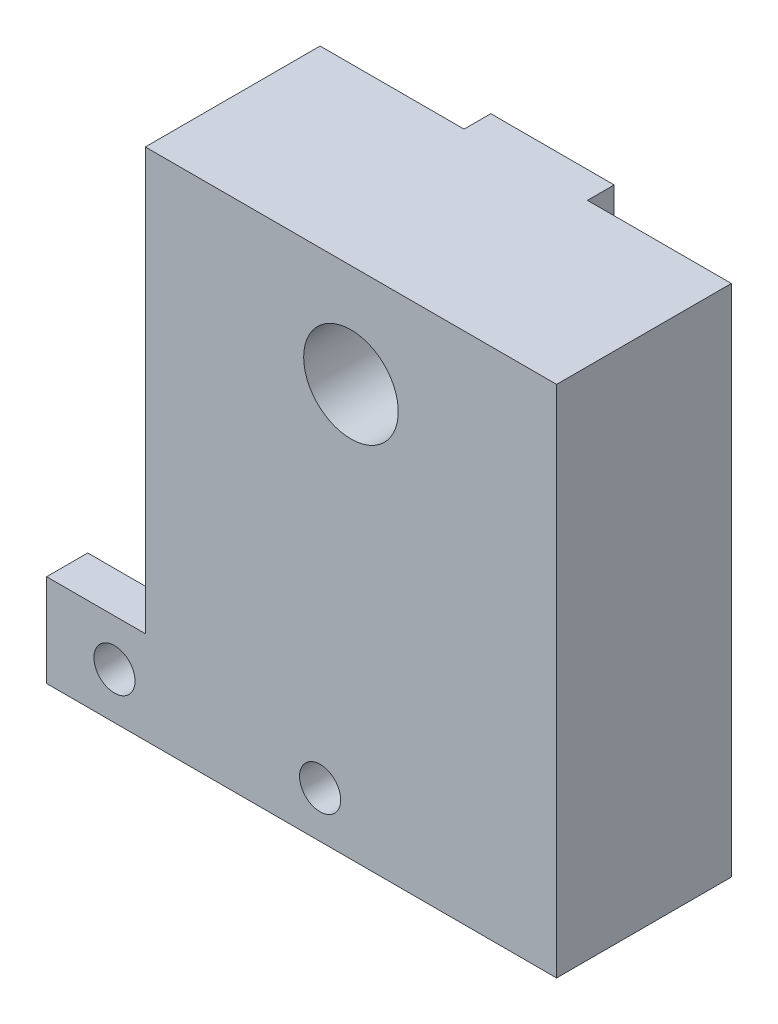
ISO-10303-21;
HEADER;
FILE_DESCRIPTION(('STEP AP214'),'2;1');
FILE_NAME('part.step','',(''),(''),'','','');
FILE_SCHEMA(('AUTOMOTIVE_DESIGN { 1 0 10303 214 1 1 1 1 }'));
ENDSEC;
DATA;
#1=APPLICATION_CONTEXT('core data for automotive mechanical design processes');
#2=APPLICATION_PROTOCOL_DEFINITION('international standard','automotive_design',2000,#1);
#3=PRODUCT_CONTEXT('',#1,'mechanical');
#4=PRODUCT('Part','Part','',(#3));
#5=PRODUCT_RELATED_PRODUCT_CATEGORY('part','',(#4));
#6=PRODUCT_DEFINITION_FORMATION('','',#4);
#7=PRODUCT_DEFINITION_CONTEXT('part definition',#1,'design');
#8=PRODUCT_DEFINITION('design','',#6,#7);
#9=PRODUCT_DEFINITION_SHAPE('','',#8);
#10=(LENGTH_UNIT() NAMED_UNIT(*) SI_UNIT(.MILLI.,.METRE.));
#11=(NAMED_UNIT(*) PLANE_ANGLE_UNIT() SI_UNIT($,.RADIAN.));
#12=(NAMED_UNIT(*) SI_UNIT($,.STERADIAN.) SOLID_ANGLE_UNIT());
#13=UNCERTAINTY_MEASURE_WITH_UNIT(LENGTH_MEASURE(1.E-05),#10,'distance_accuracy_value','');
#14=(GEOMETRIC_REPRESENTATION_CONTEXT(3) GLOBAL_UNCERTAINTY_ASSIGNED_CONTEXT((#13)) GLOBAL_UNIT_ASSIGNED_CONTEXT((#10,
#11,#12)) REPRESENTATION_CONTEXT('',''));
#15=CARTESIAN_POINT('',(0.,0.,0.));
#16=DIRECTION('',(0.,0.,1.));
#17=DIRECTION('',(1.,0.,0.));
#18=AXIS2_PLACEMENT_3D('',#15,#16,#17);
#19=CARTESIAN_POINT('',(0.,0.,0.));
#20=DIRECTION('',(0.,0.,-1.));
#21=DIRECTION('',(-1.,0.,0.));
#22=AXIS2_PLACEMENT_3D('',#19,#20,#21);
#23=PLANE('',#22);
#24=CARTESIAN_POINT('',(-1.5,2.25,0.));
#25=DIRECTION('',(0.,0.,-1.));
#26=DIRECTION('',(-1.,0.,0.));
#27=AXIS2_PLACEMENT_3D('',#24,#25,#26);
#28=CIRCLE('',#27,1.);
#29=CARTESIAN_POINT('',(-2.5,2.25,0.));
#30=VERTEX_POINT('',#29);
#31=EDGE_CURVE('E158',#30,#30,#28,.T.);
#32=ORIENTED_EDGE('',*,*,#31,.F.);
#33=EDGE_LOOP('',(#32));
#34=FACE_BOUND('',#33,.T.);
#35=CARTESIAN_POINT('',(8.5,2.25,0.));
#36=DIRECTION('',(0.,0.,-1.));
#37=DIRECTION('',(-1.,0.,0.));
#38=AXIS2_PLACEMENT_3D('',#35,#36,#37);
#39=CIRCLE('',#38,1.);
#40=CARTESIAN_POINT('',(7.5,2.25,0.));
#41=VERTEX_POINT('',#40);
#42=EDGE_CURVE('E150',#41,#41,#39,.T.);
#43=ORIENTED_EDGE('',*,*,#42,.F.);
#44=EDGE_LOOP('',(#43));
#45=FACE_BOUND('',#44,.T.);
#46=DIRECTION('',(-1.,0.,0.));
#47=VECTOR('',#46,1.);
#48=CARTESIAN_POINT('',(20.,15.,0.));
#49=LINE('',#48,#47);
#50=CARTESIAN_POINT('',(18.,15.,0.));
#51=VERTEX_POINT('',#50);
#52=CARTESIAN_POINT('',(0.,15.,0.));
#53=VERTEX_POINT('',#52);
#54=EDGE_CURVE('E142',#51,#53,#49,.T.);
#55=ORIENTED_EDGE('',*,*,#54,.F.);
#56=DIRECTION('',(0.,1.,0.));
#57=VECTOR('',#56,1.);
#58=CARTESIAN_POINT('',(18.,15.,0.));
#59=LINE('',#58,#57);
#60=CARTESIAN_POINT('',(18.,0.,0.));
#61=VERTEX_POINT('',#60);
#62=EDGE_CURVE('E153',#61,#51,#59,.T.);
#63=ORIENTED_EDGE('',*,*,#62,.F.);
#64=DIRECTION('',(1.,0.,0.));
#65=VECTOR('',#64,1.);
#66=CARTESIAN_POINT('',(0.,0.,0.));
#67=LINE('',#66,#65);
#68=CARTESIAN_POINT('',(-4.8,0.,0.));
#69=VERTEX_POINT('',#68);
#70=EDGE_CURVE('E235',#69,#61,#67,.T.);
#71=ORIENTED_EDGE('',*,*,#70,.F.);
#72=DIRECTION('',(0.,-1.,0.));
#73=VECTOR('',#72,1.);
#74=CARTESIAN_POINT('',(-4.8,0.,0.));
#75=LINE('',#74,#73);
#76=CARTESIAN_POINT('',(-4.8,4.5,0.));
#77=VERTEX_POINT('',#76);
#78=EDGE_CURVE('E177',#77,#69,#75,.T.);
#79=ORIENTED_EDGE('',*,*,#78,.F.);
#80=DIRECTION('',(-1.,0.,0.));
#81=VECTOR('',#80,1.);
#82=CARTESIAN_POINT('',(0.,4.5,0.));
#83=LINE('',#82,#81);
#84=CARTESIAN_POINT('',(0.,4.5,0.));
#85=VERTEX_POINT('',#84);
#86=EDGE_CURVE('E172',#85,#77,#83,.T.);
#87=ORIENTED_EDGE('',*,*,#86,.F.);
#88=DIRECTION('',(0.,-1.,0.));
#89=VECTOR('',#88,1.);
#90=CARTESIAN_POINT('',(0.,0.,0.));
#91=LINE('',#90,#89);
#92=EDGE_CURVE('E230',#53,#85,#91,.T.);
#93=ORIENTED_EDGE('',*,*,#92,.F.);
#94=EDGE_LOOP('',(#55,#63,#71,#79,#87,#93));
#95=FACE_BOUND('',#94,.T.);
#96=ADVANCED_FACE('F33',(#34,#45,#95),#23,.T.);
#97=CARTESIAN_POINT('',(20.,15.,-6.5));
#98=DIRECTION('',(0.,1.,0.));
#99=DIRECTION('',(0.,0.,1.));
#100=AXIS2_PLACEMENT_3D('',#97,#98,#99);
#101=PLANE('',#100);
#102=DIRECTION('',(0.,0.,1.));
#103=VECTOR('',#102,1.);
#104=CARTESIAN_POINT('',(18.,15.,-21.6327459504216));
#105=LINE('',#104,#103);
#106=CARTESIAN_POINT('',(18.,15.,-6.5));
#107=VERTEX_POINT('',#106);
#108=EDGE_CURVE('E148',#107,#51,#105,.T.);
#109=ORIENTED_EDGE('',*,*,#108,.T.);
#110=ORIENTED_EDGE('',*,*,#54,.T.);
#111=DIRECTION('',(0.,0.,1.));
#112=VECTOR('',#111,1.);
#113=CARTESIAN_POINT('',(0.,15.,-6.5));
#114=LINE('',#113,#112);
#115=CARTESIAN_POINT('',(0.,15.,-6.5));
#116=VERTEX_POINT('',#115);
#117=EDGE_CURVE('E226',#116,#53,#114,.T.);
#118=ORIENTED_EDGE('',*,*,#117,.F.);
#119=DIRECTION('',(-1.,0.,0.));
#120=VECTOR('',#119,1.);
#121=CARTESIAN_POINT('',(20.,15.,-6.5));
#122=LINE('',#121,#120);
#123=CARTESIAN_POINT('',(7.,15.,-6.5));
#124=VERTEX_POINT('',#123);
#125=EDGE_CURVE('E141',#124,#116,#122,.T.);
#126=ORIENTED_EDGE('',*,*,#125,.F.);
#127=DIRECTION('',(0.,0.,1.));
#128=VECTOR('',#127,1.);
#129=CARTESIAN_POINT('',(7.,15.,-7.8));
#130=LINE('',#129,#128);
#131=CARTESIAN_POINT('',(7.,15.,-7.8));
#132=VERTEX_POINT('',#131);
#133=EDGE_CURVE('E203',#132,#124,#130,.T.);
#134=ORIENTED_EDGE('',*,*,#133,.F.);
#135=DIRECTION('',(-1.,0.,0.));
#136=VECTOR('',#135,1.);
#137=CARTESIAN_POINT('',(13.,15.,-7.8));
#138=LINE('',#137,#136);
#139=CARTESIAN_POINT('',(13.,15.,-7.8));
#140=VERTEX_POINT('',#139);
#141=EDGE_CURVE('E201',#140,#132,#138,.T.);
#142=ORIENTED_EDGE('',*,*,#141,.F.);
#143=DIRECTION('',(0.,0.,1.));
#144=VECTOR('',#143,1.);
#145=CARTESIAN_POINT('',(13.,15.,-7.8));
#146=LINE('',#145,#144);
#147=CARTESIAN_POINT('',(13.,15.,-6.5));
#148=VERTEX_POINT('',#147);
#149=EDGE_CURVE('E210',#140,#148,#146,.T.);
#150=ORIENTED_EDGE('',*,*,#149,.T.);
#151=EDGE_CURVE('E219',#107,#148,#122,.T.);
#152=ORIENTED_EDGE('',*,*,#151,.F.);
#153=EDGE_LOOP('',(#109,#110,#118,#126,#134,#142,#150,#152));
#154=FACE_BOUND('',#153,.T.);
#155=ADVANCED_FACE('F266',(#154),#101,.F.);
#156=CARTESIAN_POINT('',(0.,0.,-6.5));
#157=DIRECTION('',(0.,0.,-1.));
#158=DIRECTION('',(-1.,0.,0.));
#159=AXIS2_PLACEMENT_3D('',#156,#157,#158);
#160=PLANE('',#159);
#161=DIRECTION('',(0.,1.,0.));
#162=VECTOR('',#161,1.);
#163=CARTESIAN_POINT('',(7.,15.,-6.5));
#164=LINE('',#163,#162);
#165=CARTESIAN_POINT('',(7.,25.,-6.5));
#166=VERTEX_POINT('',#165);
#167=EDGE_CURVE('E192',#124,#166,#164,.T.);
#168=ORIENTED_EDGE('',*,*,#167,.F.);
#169=ORIENTED_EDGE('',*,*,#125,.T.);
#170=DIRECTION('',(0.,1.,0.));
#171=VECTOR('',#170,1.);
#172=CARTESIAN_POINT('',(0.,25.,-6.5));
#173=LINE('',#172,#171);
#174=CARTESIAN_POINT('',(0.,25.,-6.5));
#175=VERTEX_POINT('',#174);
#176=EDGE_CURVE('E221',#116,#175,#173,.T.);
#177=ORIENTED_EDGE('',*,*,#176,.T.);
#178=DIRECTION('',(1.,0.,0.));
#179=VECTOR('',#178,1.);
#180=CARTESIAN_POINT('',(20.,25.,-6.5));
#181=LINE('',#180,#179);
#182=EDGE_CURVE('E224',#175,#166,#181,.T.);
#183=ORIENTED_EDGE('',*,*,#182,.T.);
#184=EDGE_LOOP('',(#168,#169,#177,#183));
#185=FACE_BOUND('',#184,.T.);
#186=ADVANCED_FACE('F282',(#185),#160,.T.);
#187=CARTESIAN_POINT('',(0.,0.,2.));
#188=DIRECTION('',(1.,0.,0.));
#189=DIRECTION('',(0.,0.,-1.));
#190=AXIS2_PLACEMENT_3D('',#187,#188,#189);
#191=PLANE('',#190);
#192=ORIENTED_EDGE('',*,*,#92,.T.);
#193=DIRECTION('',(0.,0.,1.));
#194=VECTOR('',#193,1.);
#195=CARTESIAN_POINT('',(0.,4.5,-6.57951365983839));
#196=LINE('',#195,#194);
#197=CARTESIAN_POINT('',(0.,4.5,2.));
#198=VERTEX_POINT('',#197);
#199=EDGE_CURVE('E183',#85,#198,#196,.T.);
#200=ORIENTED_EDGE('',*,*,#199,.T.);
#201=DIRECTION('',(0.,-1.,0.));
#202=VECTOR('',#201,1.);
#203=CARTESIAN_POINT('',(0.,0.,2.));
#204=LINE('',#203,#202);
#205=CARTESIAN_POINT('',(0.,25.,2.));
#206=VERTEX_POINT('',#205);
#207=EDGE_CURVE('E231',#206,#198,#204,.T.);
#208=ORIENTED_EDGE('',*,*,#207,.F.);
#209=DIRECTION('',(0.,0.,-1.));
#210=VECTOR('',#209,1.);
#211=CARTESIAN_POINT('',(0.,25.,2.));
#212=LINE('',#211,#210);
#213=EDGE_CURVE('E240',#206,#175,#212,.T.);
#214=ORIENTED_EDGE('',*,*,#213,.T.);
#215=ORIENTED_EDGE('',*,*,#176,.F.);
#216=ORIENTED_EDGE('',*,*,#117,.T.);
#217=EDGE_LOOP('',(#192,#200,#208,#214,#215,#216));
#218=FACE_BOUND('',#217,.T.);
#219=ADVANCED_FACE('F35',(#218),#191,.F.);
#220=CARTESIAN_POINT('',(0.,0.,2.));
#221=DIRECTION('',(0.,1.,0.));
#222=DIRECTION('',(0.,0.,1.));
#223=AXIS2_PLACEMENT_3D('',#220,#221,#222);
#224=PLANE('',#223);
#225=ORIENTED_EDGE('',*,*,#70,.T.);
#226=DIRECTION('',(0.,0.,1.));
#227=VECTOR('',#226,1.);
#228=CARTESIAN_POINT('',(18.,0.,-21.6327459504216));
#229=LINE('',#228,#227);
#230=CARTESIAN_POINT('',(18.,0.,-6.5));
#231=VERTEX_POINT('',#230);
#232=EDGE_CURVE('E147',#231,#61,#229,.T.);
#233=ORIENTED_EDGE('',*,*,#232,.F.);
#234=DIRECTION('',(-1.,0.,0.));
#235=VECTOR('',#234,1.);
#236=CARTESIAN_POINT('',(20.,0.,-6.5));
#237=LINE('',#236,#235);
#238=CARTESIAN_POINT('',(20.,0.,-6.5));
#239=VERTEX_POINT('',#238);
#240=EDGE_CURVE('E137',#239,#231,#237,.T.);
#241=ORIENTED_EDGE('',*,*,#240,.F.);
#242=DIRECTION('',(0.,0.,-1.));
#243=VECTOR('',#242,1.);
#244=CARTESIAN_POINT('',(20.,0.,2.));
#245=LINE('',#244,#243);
#246=CARTESIAN_POINT('',(20.,0.,2.));
#247=VERTEX_POINT('',#246);
#248=EDGE_CURVE('E11',#247,#239,#245,.T.);
#249=ORIENTED_EDGE('',*,*,#248,.F.);
#250=DIRECTION('',(1.,0.,0.));
#251=VECTOR('',#250,1.);
#252=CARTESIAN_POINT('',(0.,0.,2.));
#253=LINE('',#252,#251);
#254=CARTESIAN_POINT('',(-4.8,0.,2.));
#255=VERTEX_POINT('',#254);
#256=EDGE_CURVE('E234',#255,#247,#253,.T.);
#257=ORIENTED_EDGE('',*,*,#256,.F.);
#258=DIRECTION('',(0.,0.,1.));
#259=VECTOR('',#258,1.);
#260=CARTESIAN_POINT('',(-4.8,0.,-6.57951365983839));
#261=LINE('',#260,#259);
#262=EDGE_CURVE('E180',#69,#255,#261,.T.);
#263=ORIENTED_EDGE('',*,*,#262,.F.);
#264=EDGE_LOOP('',(#225,#233,#241,#249,#257,#263));
#265=FACE_BOUND('',#264,.T.);
#266=ADVANCED_FACE('F146',(#265),#224,.F.);
#267=CARTESIAN_POINT('',(20.,0.,2.));
#268=DIRECTION('',(-1.,0.,0.));
#269=DIRECTION('',(0.,0.,1.));
#270=AXIS2_PLACEMENT_3D('',#267,#268,#269);
#271=PLANE('',#270);
#272=ORIENTED_EDGE('',*,*,#248,.T.);
#273=DIRECTION('',(0.,-1.,0.));
#274=VECTOR('',#273,1.);
#275=CARTESIAN_POINT('',(20.,25.,-6.5));
#276=LINE('',#275,#274);
#277=CARTESIAN_POINT('',(20.,25.,-6.5));
#278=VERTEX_POINT('',#277);
#279=EDGE_CURVE('E132',#278,#239,#276,.T.);
#280=ORIENTED_EDGE('',*,*,#279,.F.);
#281=DIRECTION('',(0.,0.,-1.));
#282=VECTOR('',#281,1.);
#283=CARTESIAN_POINT('',(20.,25.,2.));
#284=LINE('',#283,#282);
#285=CARTESIAN_POINT('',(20.,25.,2.));
#286=VERTEX_POINT('',#285);
#287=EDGE_CURVE('E41',#286,#278,#284,.T.);
#288=ORIENTED_EDGE('',*,*,#287,.F.);
#289=DIRECTION('',(0.,1.,0.));
#290=VECTOR('',#289,1.);
#291=CARTESIAN_POINT('',(20.,0.,2.));
#292=LINE('',#291,#290);
#293=EDGE_CURVE('E133',#247,#286,#292,.T.);
#294=ORIENTED_EDGE('',*,*,#293,.F.);
#295=EDGE_LOOP('',(#272,#280,#288,#294));
#296=FACE_BOUND('',#295,.T.);
#297=ADVANCED_FACE('F130',(#296),#271,.F.);
#298=CARTESIAN_POINT('',(0.,25.,2.));
#299=DIRECTION('',(0.,-1.,0.));
#300=DIRECTION('',(0.,0.,-1.));
#301=AXIS2_PLACEMENT_3D('',#298,#299,#300);
#302=PLANE('',#301);
#303=ORIENTED_EDGE('',*,*,#287,.T.);
#304=CARTESIAN_POINT('',(13.,25.,-6.5));
#305=VERTEX_POINT('',#304);
#306=EDGE_CURVE('E139',#305,#278,#181,.T.);
#307=ORIENTED_EDGE('',*,*,#306,.F.);
#308=DIRECTION('',(0.,0.,1.));
#309=VECTOR('',#308,1.);
#310=CARTESIAN_POINT('',(13.,25.,-7.8));
#311=LINE('',#310,#309);
#312=CARTESIAN_POINT('',(13.,25.,-7.8));
#313=VERTEX_POINT('',#312);
#314=EDGE_CURVE('E213',#313,#305,#311,.T.);
#315=ORIENTED_EDGE('',*,*,#314,.F.);
#316=DIRECTION('',(1.,0.,0.));
#317=VECTOR('',#316,1.);
#318=CARTESIAN_POINT('',(13.,25.,-7.8));
#319=LINE('',#318,#317);
#320=CARTESIAN_POINT('',(7.,25.,-7.8));
#321=VERTEX_POINT('',#320);
#322=EDGE_CURVE('E196',#321,#313,#319,.T.);
#323=ORIENTED_EDGE('',*,*,#322,.F.);
#324=DIRECTION('',(0.,0.,1.));
#325=VECTOR('',#324,1.);
#326=CARTESIAN_POINT('',(7.,25.,-7.8));
#327=LINE('',#326,#325);
#328=EDGE_CURVE('E216',#321,#166,#327,.T.);
#329=ORIENTED_EDGE('',*,*,#328,.T.);
#330=ORIENTED_EDGE('',*,*,#182,.F.);
#331=ORIENTED_EDGE('',*,*,#213,.F.);
#332=DIRECTION('',(-1.,0.,0.));
#333=VECTOR('',#332,1.);
#334=CARTESIAN_POINT('',(0.,25.,2.));
#335=LINE('',#334,#333);
#336=EDGE_CURVE('E238',#286,#206,#335,.T.);
#337=ORIENTED_EDGE('',*,*,#336,.F.);
#338=EDGE_LOOP('',(#303,#307,#315,#323,#329,#330,#331,#337));
#339=FACE_BOUND('',#338,.T.);
#340=ADVANCED_FACE('F246',(#339),#302,.F.);
#341=CARTESIAN_POINT('',(0.,0.,2.));
#342=DIRECTION('',(0.,0.,-1.));
#343=DIRECTION('',(-1.,0.,0.));
#344=AXIS2_PLACEMENT_3D('',#341,#342,#343);
#345=PLANE('',#344);
#346=CARTESIAN_POINT('',(-1.5,2.25,2.));
#347=DIRECTION('',(0.,0.,-1.));
#348=DIRECTION('',(-1.,0.,0.));
#349=AXIS2_PLACEMENT_3D('',#346,#347,#348);
#350=CIRCLE('',#349,1.);
#351=CARTESIAN_POINT('',(-2.5,2.25,2.));
#352=VERTEX_POINT('',#351);
#353=EDGE_CURVE('E166',#352,#352,#350,.T.);
#354=ORIENTED_EDGE('',*,*,#353,.T.);
#355=EDGE_LOOP('',(#354));
#356=FACE_BOUND('',#355,.T.);
#357=CARTESIAN_POINT('',(8.5,2.25,2.));
#358=DIRECTION('',(0.,0.,-1.));
#359=DIRECTION('',(-1.,0.,0.));
#360=AXIS2_PLACEMENT_3D('',#357,#358,#359);
#361=CIRCLE('',#360,1.);
#362=CARTESIAN_POINT('',(7.5,2.25,2.));
#363=VERTEX_POINT('',#362);
#364=EDGE_CURVE('E161',#363,#363,#361,.T.);
#365=ORIENTED_EDGE('',*,*,#364,.T.);
#366=EDGE_LOOP('',(#365));
#367=FACE_BOUND('',#366,.T.);
#368=CARTESIAN_POINT('',(10.,20.,2.));
#369=DIRECTION('',(0.,0.,-1.));
#370=DIRECTION('',(-1.,0.,0.));
#371=AXIS2_PLACEMENT_3D('',#368,#369,#370);
#372=CIRCLE('',#371,2.3);
#373=CARTESIAN_POINT('',(7.7,20.,2.));
#374=VERTEX_POINT('',#373);
#375=EDGE_CURVE('E189',#374,#374,#372,.T.);
#376=ORIENTED_EDGE('',*,*,#375,.T.);
#377=EDGE_LOOP('',(#376));
#378=FACE_BOUND('',#377,.T.);
#379=ORIENTED_EDGE('',*,*,#207,.T.);
#380=DIRECTION('',(-1.,0.,0.));
#381=VECTOR('',#380,1.);
#382=CARTESIAN_POINT('',(0.,4.5,2.));
#383=LINE('',#382,#381);
#384=CARTESIAN_POINT('',(-4.8,4.5,2.));
#385=VERTEX_POINT('',#384);
#386=EDGE_CURVE('E56',#198,#385,#383,.T.);
#387=ORIENTED_EDGE('',*,*,#386,.T.);
#388=DIRECTION('',(0.,-1.,0.));
#389=VECTOR('',#388,1.);
#390=CARTESIAN_POINT('',(-4.8,0.,2.));
#391=LINE('',#390,#389);
#392=EDGE_CURVE('E169',#385,#255,#391,.T.);
#393=ORIENTED_EDGE('',*,*,#392,.T.);
#394=ORIENTED_EDGE('',*,*,#256,.T.);
#395=ORIENTED_EDGE('',*,*,#293,.T.);
#396=ORIENTED_EDGE('',*,*,#336,.T.);
#397=EDGE_LOOP('',(#379,#387,#393,#394,#395,#396));
#398=FACE_BOUND('',#397,.T.);
#399=ADVANCED_FACE('F252',(#356,#367,#378,#398),#345,.F.);
#400=DIRECTION('',(0.,-1.,0.));
#401=VECTOR('',#400,1.);
#402=CARTESIAN_POINT('',(13.,15.,-6.5));
#403=LINE('',#402,#401);
#404=EDGE_CURVE('E197',#305,#148,#403,.T.);
#405=ORIENTED_EDGE('',*,*,#404,.F.);
#406=ORIENTED_EDGE('',*,*,#306,.T.);
#407=ORIENTED_EDGE('',*,*,#279,.T.);
#408=ORIENTED_EDGE('',*,*,#240,.T.);
#409=DIRECTION('',(0.,1.,0.));
#410=VECTOR('',#409,1.);
#411=CARTESIAN_POINT('',(18.,15.,-6.5));
#412=LINE('',#411,#410);
#413=EDGE_CURVE('E48',#231,#107,#412,.T.);
#414=ORIENTED_EDGE('',*,*,#413,.T.);
#415=ORIENTED_EDGE('',*,*,#151,.T.);
#416=EDGE_LOOP('',(#405,#406,#407,#408,#414,#415));
#417=FACE_BOUND('',#416,.T.);
#418=ADVANCED_FACE('F136',(#417),#160,.T.);
#419=CARTESIAN_POINT('',(7.,15.,-7.8));
#420=DIRECTION('',(1.,0.,0.));
#421=DIRECTION('',(0.,0.,-1.));
#422=AXIS2_PLACEMENT_3D('',#419,#420,#421);
#423=PLANE('',#422);
#424=ORIENTED_EDGE('',*,*,#167,.T.);
#425=ORIENTED_EDGE('',*,*,#328,.F.);
#426=DIRECTION('',(0.,1.,0.));
#427=VECTOR('',#426,1.);
#428=CARTESIAN_POINT('',(7.,15.,-7.8));
#429=LINE('',#428,#427);
#430=EDGE_CURVE('E193',#132,#321,#429,.T.);
#431=ORIENTED_EDGE('',*,*,#430,.F.);
#432=ORIENTED_EDGE('',*,*,#133,.T.);
#433=EDGE_LOOP('',(#424,#425,#431,#432));
#434=FACE_BOUND('',#433,.T.);
#435=ADVANCED_FACE('F279',(#434),#423,.F.);
#436=CARTESIAN_POINT('',(13.,15.,-7.8));
#437=DIRECTION('',(-1.,0.,0.));
#438=DIRECTION('',(0.,-1.,0.));
#439=AXIS2_PLACEMENT_3D('',#436,#437,#438);
#440=PLANE('',#439);
#441=ORIENTED_EDGE('',*,*,#404,.T.);
#442=ORIENTED_EDGE('',*,*,#149,.F.);
#443=DIRECTION('',(0.,-1.,0.));
#444=VECTOR('',#443,1.);
#445=CARTESIAN_POINT('',(13.,15.,-7.8));
#446=LINE('',#445,#444);
#447=EDGE_CURVE('E199',#313,#140,#446,.T.);
#448=ORIENTED_EDGE('',*,*,#447,.F.);
#449=ORIENTED_EDGE('',*,*,#314,.T.);
#450=EDGE_LOOP('',(#441,#442,#448,#449));
#451=FACE_BOUND('',#450,.T.);
#452=ADVANCED_FACE('F271',(#451),#440,.F.);
#453=CARTESIAN_POINT('',(0.,0.,-7.8));
#454=DIRECTION('',(0.,0.,1.));
#455=DIRECTION('',(1.,0.,0.));
#456=AXIS2_PLACEMENT_3D('',#453,#454,#455);
#457=PLANE('',#456);
#458=CARTESIAN_POINT('',(10.,20.,-7.8));
#459=DIRECTION('',(0.,0.,-1.));
#460=DIRECTION('',(-1.,0.,0.));
#461=AXIS2_PLACEMENT_3D('',#458,#459,#460);
#462=CIRCLE('',#461,2.3);
#463=CARTESIAN_POINT('',(7.7,20.,-7.8));
#464=VERTEX_POINT('',#463);
#465=EDGE_CURVE('E186',#464,#464,#462,.T.);
#466=ORIENTED_EDGE('',*,*,#465,.F.);
#467=EDGE_LOOP('',(#466));
#468=FACE_BOUND('',#467,.T.);
#469=ORIENTED_EDGE('',*,*,#430,.T.);
#470=ORIENTED_EDGE('',*,*,#322,.T.);
#471=ORIENTED_EDGE('',*,*,#447,.T.);
#472=ORIENTED_EDGE('',*,*,#141,.T.);
#473=EDGE_LOOP('',(#469,#470,#471,#472));
#474=FACE_BOUND('',#473,.T.);
#475=ADVANCED_FACE('F276',(#468,#474),#457,.F.);
#476=CARTESIAN_POINT('',(10.,20.,2.));
#477=DIRECTION('',(0.,0.,-1.));
#478=DIRECTION('',(-1.,0.,0.));
#479=AXIS2_PLACEMENT_3D('',#476,#477,#478);
#480=CYLINDRICAL_SURFACE('',#479,2.3);
#481=ORIENTED_EDGE('',*,*,#375,.F.);
#482=EDGE_LOOP('',(#481));
#483=FACE_BOUND('',#482,.T.);
#484=ORIENTED_EDGE('',*,*,#465,.T.);
#485=EDGE_LOOP('',(#484));
#486=FACE_BOUND('',#485,.T.);
#487=ADVANCED_FACE('F287',(#483,#486),#480,.F.);
#488=CARTESIAN_POINT('',(0.,4.5,-6.57951365983839));
#489=DIRECTION('',(0.,1.,0.));
#490=DIRECTION('',(-1.,0.,0.));
#491=AXIS2_PLACEMENT_3D('',#488,#489,#490);
#492=PLANE('',#491);
#493=ORIENTED_EDGE('',*,*,#199,.F.);
#494=ORIENTED_EDGE('',*,*,#86,.T.);
#495=DIRECTION('',(0.,0.,1.));
#496=VECTOR('',#495,1.);
#497=CARTESIAN_POINT('',(-4.8,4.5,-6.57951365983839));
#498=LINE('',#497,#496);
#499=EDGE_CURVE('E176',#77,#385,#498,.T.);
#500=ORIENTED_EDGE('',*,*,#499,.T.);
#501=ORIENTED_EDGE('',*,*,#386,.F.);
#502=EDGE_LOOP('',(#493,#494,#500,#501));
#503=FACE_BOUND('',#502,.T.);
#504=ADVANCED_FACE('F285',(#503),#492,.T.);
#505=CARTESIAN_POINT('',(-4.8,0.,-6.57951365983839));
#506=DIRECTION('',(-1.,0.,0.));
#507=DIRECTION('',(0.,0.,1.));
#508=AXIS2_PLACEMENT_3D('',#505,#506,#507);
#509=PLANE('',#508);
#510=ORIENTED_EDGE('',*,*,#499,.F.);
#511=ORIENTED_EDGE('',*,*,#78,.T.);
#512=ORIENTED_EDGE('',*,*,#262,.T.);
#513=ORIENTED_EDGE('',*,*,#392,.F.);
#514=EDGE_LOOP('',(#510,#511,#512,#513));
#515=FACE_BOUND('',#514,.T.);
#516=ADVANCED_FACE('F257',(#515),#509,.T.);
#517=CARTESIAN_POINT('',(8.5,2.25,10.));
#518=DIRECTION('',(0.,0.,-1.));
#519=DIRECTION('',(-1.,0.,0.));
#520=AXIS2_PLACEMENT_3D('',#517,#518,#519);
#521=CYLINDRICAL_SURFACE('',#520,1.);
#522=ORIENTED_EDGE('',*,*,#42,.T.);
#523=EDGE_LOOP('',(#522));
#524=FACE_BOUND('',#523,.T.);
#525=ORIENTED_EDGE('',*,*,#364,.F.);
#526=EDGE_LOOP('',(#525));
#527=FACE_BOUND('',#526,.T.);
#528=ADVANCED_FACE('F293',(#524,#527),#521,.F.);
#529=CARTESIAN_POINT('',(-1.5,2.25,10.));
#530=DIRECTION('',(0.,0.,-1.));
#531=DIRECTION('',(-1.,0.,0.));
#532=AXIS2_PLACEMENT_3D('',#529,#530,#531);
#533=CYLINDRICAL_SURFACE('',#532,1.);
#534=ORIENTED_EDGE('',*,*,#31,.T.);
#535=EDGE_LOOP('',(#534));
#536=FACE_BOUND('',#535,.T.);
#537=ORIENTED_EDGE('',*,*,#353,.F.);
#538=EDGE_LOOP('',(#537));
#539=FACE_BOUND('',#538,.T.);
#540=ADVANCED_FACE('F423',(#536,#539),#533,.F.);
#541=CARTESIAN_POINT('',(18.,15.,-21.6327459504216));
#542=DIRECTION('',(1.,0.,0.));
#543=DIRECTION('',(0.,1.,0.));
#544=AXIS2_PLACEMENT_3D('',#541,#542,#543);
#545=PLANE('',#544);
#546=ORIENTED_EDGE('',*,*,#413,.F.);
#547=ORIENTED_EDGE('',*,*,#232,.T.);
#548=ORIENTED_EDGE('',*,*,#62,.T.);
#549=ORIENTED_EDGE('',*,*,#108,.F.);
#550=EDGE_LOOP('',(#546,#547,#548,#549));
#551=FACE_BOUND('',#550,.T.);
#552=ADVANCED_FACE('F263',(#551),#545,.F.);
#553=CLOSED_SHELL('',(#96,#155,#186,#219,#266,#297,#340,#399,#418,#435,#452,#475,#487,#504,#516,
#528,#540,#552));
#554=MANIFOLD_SOLID_BREP('B2',#553);
#555=ADVANCED_BREP_SHAPE_REPRESENTATION('',(#18,#554),#14);
#556=SHAPE_DEFINITION_REPRESENTATION(#9,#555);
ENDSEC;
END-ISO-10303-21;
